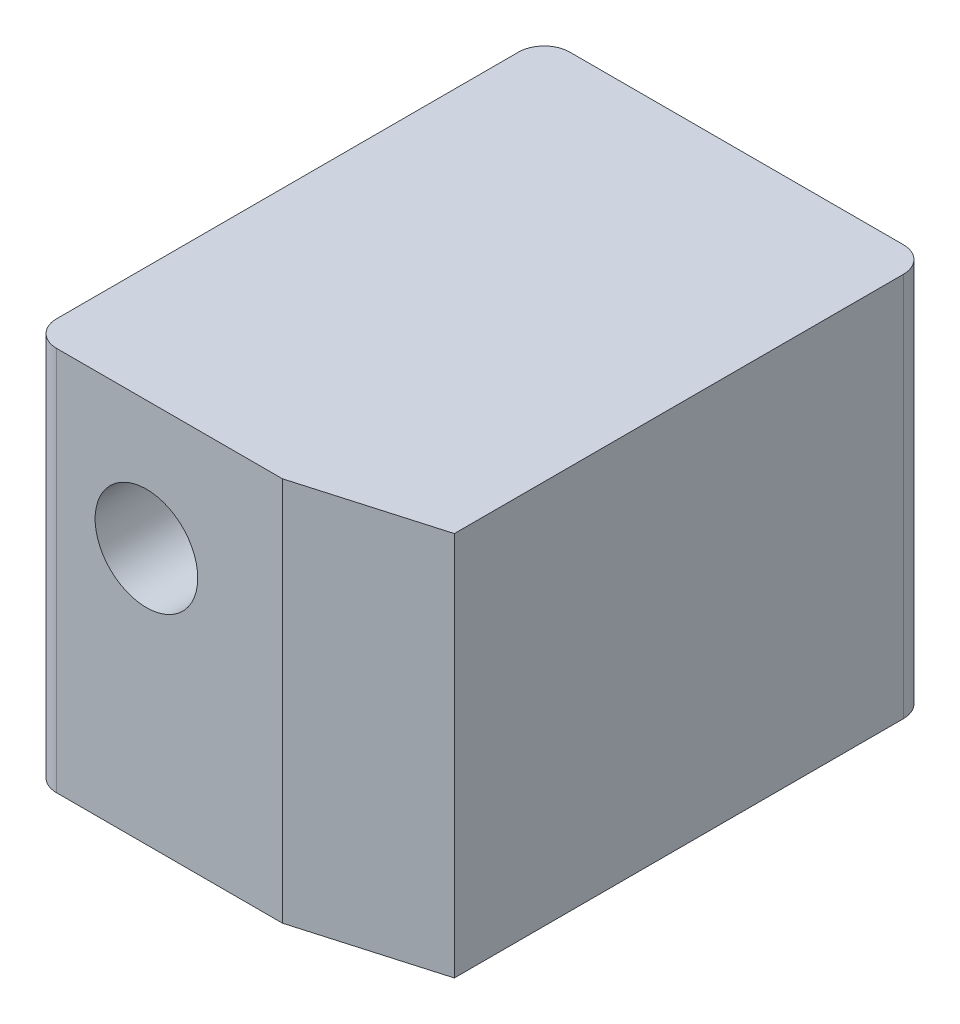
ISO-10303-21;
HEADER;
FILE_DESCRIPTION(('STEP AP214'),'2;1');
FILE_NAME('part.step','',(''),(''),'','','');
FILE_SCHEMA(('AUTOMOTIVE_DESIGN { 1 0 10303 214 1 1 1 1 }'));
ENDSEC;
DATA;
#1=APPLICATION_CONTEXT('core data for automotive mechanical design processes');
#2=APPLICATION_PROTOCOL_DEFINITION('international standard','automotive_design',2000,#1);
#3=PRODUCT_CONTEXT('',#1,'mechanical');
#4=PRODUCT('Part','Part','',(#3));
#5=PRODUCT_RELATED_PRODUCT_CATEGORY('part','',(#4));
#6=PRODUCT_DEFINITION_FORMATION('','',#4);
#7=PRODUCT_DEFINITION_CONTEXT('part definition',#1,'design');
#8=PRODUCT_DEFINITION('design','',#6,#7);
#9=PRODUCT_DEFINITION_SHAPE('','',#8);
#10=(LENGTH_UNIT() NAMED_UNIT(*) SI_UNIT(.MILLI.,.METRE.));
#11=(NAMED_UNIT(*) PLANE_ANGLE_UNIT() SI_UNIT($,.RADIAN.));
#12=(NAMED_UNIT(*) SI_UNIT($,.STERADIAN.) SOLID_ANGLE_UNIT());
#13=UNCERTAINTY_MEASURE_WITH_UNIT(LENGTH_MEASURE(1.E-05),#10,'distance_accuracy_value','');
#14=(GEOMETRIC_REPRESENTATION_CONTEXT(3) GLOBAL_UNCERTAINTY_ASSIGNED_CONTEXT((#13)) GLOBAL_UNIT_ASSIGNED_CONTEXT((#10,
#11,#12)) REPRESENTATION_CONTEXT('',''));
#15=CARTESIAN_POINT('',(0.,0.,0.));
#16=DIRECTION('',(0.,0.,1.));
#17=DIRECTION('',(1.,0.,0.));
#18=AXIS2_PLACEMENT_3D('',#15,#16,#17);
#19=CARTESIAN_POINT('',(0.,15.,0.));
#20=DIRECTION('',(0.,0.,-1.));
#21=DIRECTION('',(-1.,0.,0.));
#22=AXIS2_PLACEMENT_3D('',#19,#20,#21);
#23=PLANE('',#22);
#24=CARTESIAN_POINT('',(-3.,10.,0.));
#25=DIRECTION('',(0.,0.,1.));
#26=DIRECTION('',(1.,0.,0.));
#27=AXIS2_PLACEMENT_3D('',#24,#25,#26);
#28=CIRCLE('',#27,2.);
#29=CARTESIAN_POINT('',(-1.,10.,0.));
#30=VERTEX_POINT('',#29);
#31=EDGE_CURVE('E110',#30,#30,#28,.T.);
#32=ORIENTED_EDGE('',*,*,#31,.F.);
#33=EDGE_LOOP('',(#32));
#34=FACE_BOUND('',#33,.T.);
#35=DIRECTION('',(1.,0.,0.));
#36=VECTOR('',#35,1.);
#37=CARTESIAN_POINT('',(0.,0.,0.));
#38=LINE('',#37,#36);
#39=CARTESIAN_POINT('',(-6.5,0.,0.));
#40=VERTEX_POINT('',#39);
#41=CARTESIAN_POINT('',(2.30000000000001,0.,0.));
#42=VERTEX_POINT('',#41);
#43=EDGE_CURVE('E127',#40,#42,#38,.T.);
#44=ORIENTED_EDGE('',*,*,#43,.T.);
#45=DIRECTION('',(0.,1.,0.));
#46=VECTOR('',#45,1.);
#47=CARTESIAN_POINT('',(2.3,-0.000999999999999265,0.));
#48=LINE('',#47,#46);
#49=CARTESIAN_POINT('',(2.3,15.,0.));
#50=VERTEX_POINT('',#49);
#51=EDGE_CURVE('E52',#42,#50,#48,.T.);
#52=ORIENTED_EDGE('',*,*,#51,.T.);
#53=DIRECTION('',(1.,0.,0.));
#54=VECTOR('',#53,1.);
#55=CARTESIAN_POINT('',(0.,15.,0.));
#56=LINE('',#55,#54);
#57=CARTESIAN_POINT('',(-6.5,15.,0.));
#58=VERTEX_POINT('',#57);
#59=EDGE_CURVE('E137',#58,#50,#56,.T.);
#60=ORIENTED_EDGE('',*,*,#59,.F.);
#61=DIRECTION('',(0.,-1.,0.));
#62=VECTOR('',#61,1.);
#63=CARTESIAN_POINT('',(-6.5,15.,0.));
#64=LINE('',#63,#62);
#65=EDGE_CURVE('E11',#58,#40,#64,.T.);
#66=ORIENTED_EDGE('',*,*,#65,.T.);
#67=EDGE_LOOP('',(#44,#52,#60,#66));
#68=FACE_BOUND('',#67,.T.);
#69=ADVANCED_FACE('F37',(#34,#68),#23,.F.);
#70=CARTESIAN_POINT('',(7.5,15.,-20.));
#71=DIRECTION('',(-1.,0.,0.));
#72=DIRECTION('',(0.,0.,1.));
#73=AXIS2_PLACEMENT_3D('',#70,#71,#72);
#74=PLANE('',#73);
#75=DIRECTION('',(0.,0.,-1.));
#76=VECTOR('',#75,1.);
#77=CARTESIAN_POINT('',(7.5,15.,-20.));
#78=LINE('',#77,#76);
#79=CARTESIAN_POINT('',(7.5,15.,-1.5));
#80=VERTEX_POINT('',#79);
#81=CARTESIAN_POINT('',(7.5,15.,-19.));
#82=VERTEX_POINT('',#81);
#83=EDGE_CURVE('E118',#80,#82,#78,.T.);
#84=ORIENTED_EDGE('',*,*,#83,.F.);
#85=DIRECTION('',(0.,1.,0.));
#86=VECTOR('',#85,1.);
#87=CARTESIAN_POINT('',(7.5,-0.000999999999999265,-1.5));
#88=LINE('',#87,#86);
#89=CARTESIAN_POINT('',(7.5,0.,-1.5));
#90=VERTEX_POINT('',#89);
#91=EDGE_CURVE('E104',#90,#80,#88,.T.);
#92=ORIENTED_EDGE('',*,*,#91,.F.);
#93=DIRECTION('',(0.,0.,-1.));
#94=VECTOR('',#93,1.);
#95=CARTESIAN_POINT('',(7.5,0.,-20.));
#96=LINE('',#95,#94);
#97=CARTESIAN_POINT('',(7.5,0.,-19.));
#98=VERTEX_POINT('',#97);
#99=EDGE_CURVE('E116',#90,#98,#96,.T.);
#100=ORIENTED_EDGE('',*,*,#99,.T.);
#101=DIRECTION('',(0.,-1.,0.));
#102=VECTOR('',#101,1.);
#103=CARTESIAN_POINT('',(7.5,15.,-19.));
#104=LINE('',#103,#102);
#105=EDGE_CURVE('E149',#98,#82,#104,.F.);
#106=ORIENTED_EDGE('',*,*,#105,.T.);
#107=EDGE_LOOP('',(#84,#92,#100,#106));
#108=FACE_BOUND('',#107,.T.);
#109=ADVANCED_FACE('F114',(#108),#74,.F.);
#110=CARTESIAN_POINT('',(-7.5,15.,-20.));
#111=DIRECTION('',(0.,0.,1.));
#112=DIRECTION('',(1.,0.,0.));
#113=AXIS2_PLACEMENT_3D('',#110,#111,#112);
#114=PLANE('',#113);
#115=DIRECTION('',(-1.,0.,0.));
#116=VECTOR('',#115,1.);
#117=CARTESIAN_POINT('',(-7.5,15.,-20.));
#118=LINE('',#117,#116);
#119=CARTESIAN_POINT('',(6.5,15.,-20.));
#120=VERTEX_POINT('',#119);
#121=CARTESIAN_POINT('',(-6.5,15.,-20.));
#122=VERTEX_POINT('',#121);
#123=EDGE_CURVE('E171',#120,#122,#118,.T.);
#124=ORIENTED_EDGE('',*,*,#123,.F.);
#125=DIRECTION('',(0.,-1.,0.));
#126=VECTOR('',#125,1.);
#127=CARTESIAN_POINT('',(6.5,15.,-20.));
#128=LINE('',#127,#126);
#129=CARTESIAN_POINT('',(6.5,0.,-20.));
#130=VERTEX_POINT('',#129);
#131=EDGE_CURVE('E140',#120,#130,#128,.T.);
#132=ORIENTED_EDGE('',*,*,#131,.T.);
#133=DIRECTION('',(-1.,0.,0.));
#134=VECTOR('',#133,1.);
#135=CARTESIAN_POINT('',(-7.5,0.,-20.));
#136=LINE('',#135,#134);
#137=CARTESIAN_POINT('',(-6.5,0.,-20.));
#138=VERTEX_POINT('',#137);
#139=EDGE_CURVE('E126',#130,#138,#136,.T.);
#140=ORIENTED_EDGE('',*,*,#139,.T.);
#141=DIRECTION('',(0.,-1.,0.));
#142=VECTOR('',#141,1.);
#143=CARTESIAN_POINT('',(-6.5,15.,-20.));
#144=LINE('',#143,#142);
#145=EDGE_CURVE('E138',#138,#122,#144,.F.);
#146=ORIENTED_EDGE('',*,*,#145,.T.);
#147=EDGE_LOOP('',(#124,#132,#140,#146));
#148=FACE_BOUND('',#147,.T.);
#149=ADVANCED_FACE('F183',(#148),#114,.F.);
#150=CARTESIAN_POINT('',(-7.5,15.,0.));
#151=DIRECTION('',(1.,0.,0.));
#152=DIRECTION('',(0.,0.,-1.));
#153=AXIS2_PLACEMENT_3D('',#150,#151,#152);
#154=PLANE('',#153);
#155=DIRECTION('',(0.,0.,1.));
#156=VECTOR('',#155,1.);
#157=CARTESIAN_POINT('',(-7.5,15.,0.));
#158=LINE('',#157,#156);
#159=CARTESIAN_POINT('',(-7.5,15.,-19.));
#160=VERTEX_POINT('',#159);
#161=CARTESIAN_POINT('',(-7.5,15.,-1.));
#162=VERTEX_POINT('',#161);
#163=EDGE_CURVE('E141',#160,#162,#158,.T.);
#164=ORIENTED_EDGE('',*,*,#163,.F.);
#165=DIRECTION('',(0.,-1.,0.));
#166=VECTOR('',#165,1.);
#167=CARTESIAN_POINT('',(-7.5,15.,-19.));
#168=LINE('',#167,#166);
#169=CARTESIAN_POINT('',(-7.5,0.,-19.));
#170=VERTEX_POINT('',#169);
#171=EDGE_CURVE('E45',#160,#170,#168,.T.);
#172=ORIENTED_EDGE('',*,*,#171,.T.);
#173=DIRECTION('',(0.,0.,1.));
#174=VECTOR('',#173,1.);
#175=CARTESIAN_POINT('',(-7.5,0.,0.));
#176=LINE('',#175,#174);
#177=CARTESIAN_POINT('',(-7.5,0.,-1.));
#178=VERTEX_POINT('',#177);
#179=EDGE_CURVE('E130',#170,#178,#176,.T.);
#180=ORIENTED_EDGE('',*,*,#179,.T.);
#181=DIRECTION('',(0.,-1.,0.));
#182=VECTOR('',#181,1.);
#183=CARTESIAN_POINT('',(-7.5,15.,-1.));
#184=LINE('',#183,#182);
#185=EDGE_CURVE('E60',#178,#162,#184,.F.);
#186=ORIENTED_EDGE('',*,*,#185,.T.);
#187=EDGE_LOOP('',(#164,#172,#180,#186));
#188=FACE_BOUND('',#187,.T.);
#189=ADVANCED_FACE('F160',(#188),#154,.F.);
#190=CARTESIAN_POINT('',(0.,15.,0.));
#191=DIRECTION('',(0.,-1.,0.));
#192=DIRECTION('',(0.,0.,-1.));
#193=AXIS2_PLACEMENT_3D('',#190,#191,#192);
#194=PLANE('',#193);
#195=ORIENTED_EDGE('',*,*,#59,.T.);
#196=DIRECTION('',(-0.960823591180894,0.,0.277160651302181));
#197=VECTOR('',#196,1.);
#198=CARTESIAN_POINT('',(2.3,15.,0.));
#199=LINE('',#198,#197);
#200=EDGE_CURVE('E119',#80,#50,#199,.T.);
#201=ORIENTED_EDGE('',*,*,#200,.F.);
#202=ORIENTED_EDGE('',*,*,#83,.T.);
#203=CARTESIAN_POINT('',(6.5,15.,-19.));
#204=DIRECTION('',(0.,-1.,0.));
#205=DIRECTION('',(0.,0.,-1.));
#206=AXIS2_PLACEMENT_3D('',#203,#204,#205);
#207=CIRCLE('',#206,1.);
#208=EDGE_CURVE('E155',#82,#120,#207,.F.);
#209=ORIENTED_EDGE('',*,*,#208,.T.);
#210=ORIENTED_EDGE('',*,*,#123,.T.);
#211=CARTESIAN_POINT('',(-6.5,15.,-19.));
#212=DIRECTION('',(0.,-1.,0.));
#213=DIRECTION('',(0.,0.,-1.));
#214=AXIS2_PLACEMENT_3D('',#211,#212,#213);
#215=CIRCLE('',#214,1.);
#216=EDGE_CURVE('E153',#122,#160,#215,.F.);
#217=ORIENTED_EDGE('',*,*,#216,.T.);
#218=ORIENTED_EDGE('',*,*,#163,.T.);
#219=CARTESIAN_POINT('',(-6.5,15.,-1.));
#220=DIRECTION('',(0.,-1.,0.));
#221=DIRECTION('',(0.,0.,-1.));
#222=AXIS2_PLACEMENT_3D('',#219,#220,#221);
#223=CIRCLE('',#222,1.);
#224=EDGE_CURVE('E151',#162,#58,#223,.F.);
#225=ORIENTED_EDGE('',*,*,#224,.T.);
#226=EDGE_LOOP('',(#195,#201,#202,#209,#210,#217,#218,#225));
#227=FACE_BOUND('',#226,.T.);
#228=ADVANCED_FACE('F178',(#227),#194,.F.);
#229=CARTESIAN_POINT('',(0.,0.,0.));
#230=DIRECTION('',(0.,-1.,0.));
#231=DIRECTION('',(0.,0.,-1.));
#232=AXIS2_PLACEMENT_3D('',#229,#230,#231);
#233=PLANE('',#232);
#234=DIRECTION('',(-0.960823591180895,0.,0.277160651302181));
#235=VECTOR('',#234,1.);
#236=CARTESIAN_POINT('',(2.3,0.,0.));
#237=LINE('',#236,#235);
#238=EDGE_CURVE('E101',#90,#42,#237,.T.);
#239=ORIENTED_EDGE('',*,*,#238,.T.);
#240=ORIENTED_EDGE('',*,*,#43,.F.);
#241=CARTESIAN_POINT('',(-6.5,0.,-1.));
#242=DIRECTION('',(0.,-1.,0.));
#243=DIRECTION('',(0.,0.,-1.));
#244=AXIS2_PLACEMENT_3D('',#241,#242,#243);
#245=CIRCLE('',#244,1.);
#246=EDGE_CURVE('E144',#40,#178,#245,.T.);
#247=ORIENTED_EDGE('',*,*,#246,.T.);
#248=ORIENTED_EDGE('',*,*,#179,.F.);
#249=CARTESIAN_POINT('',(-6.5,0.,-19.));
#250=DIRECTION('',(0.,-1.,0.));
#251=DIRECTION('',(0.,0.,-1.));
#252=AXIS2_PLACEMENT_3D('',#249,#250,#251);
#253=CIRCLE('',#252,1.);
#254=EDGE_CURVE('E146',#170,#138,#253,.T.);
#255=ORIENTED_EDGE('',*,*,#254,.T.);
#256=ORIENTED_EDGE('',*,*,#139,.F.);
#257=CARTESIAN_POINT('',(6.5,0.,-19.));
#258=DIRECTION('',(0.,-1.,0.));
#259=DIRECTION('',(0.,0.,-1.));
#260=AXIS2_PLACEMENT_3D('',#257,#258,#259);
#261=CIRCLE('',#260,1.);
#262=EDGE_CURVE('E124',#130,#98,#261,.T.);
#263=ORIENTED_EDGE('',*,*,#262,.T.);
#264=ORIENTED_EDGE('',*,*,#99,.F.);
#265=EDGE_LOOP('',(#239,#240,#247,#248,#255,#256,#263,#264));
#266=FACE_BOUND('',#265,.T.);
#267=CARTESIAN_POINT('',(-3.,0.,-16.));
#268=DIRECTION('',(0.,-1.,0.));
#269=DIRECTION('',(0.,0.,-1.));
#270=AXIS2_PLACEMENT_3D('',#267,#268,#269);
#271=CIRCLE('',#270,2.);
#272=CARTESIAN_POINT('',(-3.,0.,-18.));
#273=VERTEX_POINT('',#272);
#274=EDGE_CURVE('E198',#273,#273,#271,.T.);
#275=ORIENTED_EDGE('',*,*,#274,.F.);
#276=EDGE_LOOP('',(#275));
#277=FACE_BOUND('',#276,.T.);
#278=CARTESIAN_POINT('',(3.,0.,-4.));
#279=DIRECTION('',(0.,-1.,0.));
#280=DIRECTION('',(0.,0.,-1.));
#281=AXIS2_PLACEMENT_3D('',#278,#279,#280);
#282=CIRCLE('',#281,2.);
#283=CARTESIAN_POINT('',(3.,0.,-6.));
#284=VERTEX_POINT('',#283);
#285=EDGE_CURVE('E174',#284,#284,#282,.T.);
#286=ORIENTED_EDGE('',*,*,#285,.F.);
#287=EDGE_LOOP('',(#286));
#288=FACE_BOUND('',#287,.T.);
#289=ADVANCED_FACE('F121',(#266,#277,#288),#233,.T.);
#290=CARTESIAN_POINT('',(3.,12.,-4.));
#291=DIRECTION('',(0.,-1.,0.));
#292=DIRECTION('',(0.,0.,-1.));
#293=AXIS2_PLACEMENT_3D('',#290,#291,#292);
#294=CYLINDRICAL_SURFACE('',#293,2.);
#295=CARTESIAN_POINT('',(3.,12.,-4.));
#296=DIRECTION('',(0.,-1.,0.));
#297=DIRECTION('',(0.,0.,-1.));
#298=AXIS2_PLACEMENT_3D('',#295,#296,#297);
#299=CIRCLE('',#298,2.);
#300=CARTESIAN_POINT('',(3.,12.,-6.));
#301=VERTEX_POINT('',#300);
#302=EDGE_CURVE('E200',#301,#301,#299,.T.);
#303=ORIENTED_EDGE('',*,*,#302,.F.);
#304=EDGE_LOOP('',(#303));
#305=FACE_BOUND('',#304,.T.);
#306=ORIENTED_EDGE('',*,*,#285,.T.);
#307=EDGE_LOOP('',(#306));
#308=FACE_BOUND('',#307,.T.);
#309=ADVANCED_FACE('F207',(#305,#308),#294,.F.);
#310=CARTESIAN_POINT('',(3.,12.,-4.));
#311=DIRECTION('',(0.,-1.,0.));
#312=DIRECTION('',(0.,0.,-1.));
#313=AXIS2_PLACEMENT_3D('',#310,#311,#312);
#314=PLANE('',#313);
#315=ORIENTED_EDGE('',*,*,#302,.T.);
#316=EDGE_LOOP('',(#315));
#317=FACE_BOUND('',#316,.T.);
#318=ADVANCED_FACE('F215',(#317),#314,.T.);
#319=CARTESIAN_POINT('',(-3.,12.,-16.));
#320=DIRECTION('',(0.,-1.,0.));
#321=DIRECTION('',(0.,0.,-1.));
#322=AXIS2_PLACEMENT_3D('',#319,#320,#321);
#323=CYLINDRICAL_SURFACE('',#322,2.);
#324=CARTESIAN_POINT('',(-3.,12.,-16.));
#325=DIRECTION('',(0.,-1.,0.));
#326=DIRECTION('',(0.,0.,-1.));
#327=AXIS2_PLACEMENT_3D('',#324,#325,#326);
#328=CIRCLE('',#327,2.);
#329=CARTESIAN_POINT('',(-3.,12.,-18.));
#330=VERTEX_POINT('',#329);
#331=EDGE_CURVE('E132',#330,#330,#328,.T.);
#332=ORIENTED_EDGE('',*,*,#331,.F.);
#333=EDGE_LOOP('',(#332));
#334=FACE_BOUND('',#333,.T.);
#335=ORIENTED_EDGE('',*,*,#274,.T.);
#336=EDGE_LOOP('',(#335));
#337=FACE_BOUND('',#336,.T.);
#338=ADVANCED_FACE('F253',(#334,#337),#323,.F.);
#339=CARTESIAN_POINT('',(-3.,12.,-16.));
#340=DIRECTION('',(0.,-1.,0.));
#341=DIRECTION('',(0.,0.,-1.));
#342=AXIS2_PLACEMENT_3D('',#339,#340,#341);
#343=PLANE('',#342);
#344=ORIENTED_EDGE('',*,*,#331,.T.);
#345=EDGE_LOOP('',(#344));
#346=FACE_BOUND('',#345,.T.);
#347=ADVANCED_FACE('F249',(#346),#343,.T.);
#348=CARTESIAN_POINT('',(-3.,10.,-12.));
#349=DIRECTION('',(0.,0.,1.));
#350=DIRECTION('',(1.,0.,0.));
#351=AXIS2_PLACEMENT_3D('',#348,#349,#350);
#352=CYLINDRICAL_SURFACE('',#351,2.);
#353=CARTESIAN_POINT('',(-3.,10.,-12.));
#354=DIRECTION('',(0.,0.,1.));
#355=DIRECTION('',(1.,0.,0.));
#356=AXIS2_PLACEMENT_3D('',#353,#354,#355);
#357=CIRCLE('',#356,2.);
#358=CARTESIAN_POINT('',(-1.,10.,-12.));
#359=VERTEX_POINT('',#358);
#360=EDGE_CURVE('E191',#359,#359,#357,.T.);
#361=ORIENTED_EDGE('',*,*,#360,.F.);
#362=EDGE_LOOP('',(#361));
#363=FACE_BOUND('',#362,.T.);
#364=ORIENTED_EDGE('',*,*,#31,.T.);
#365=EDGE_LOOP('',(#364));
#366=FACE_BOUND('',#365,.T.);
#367=ADVANCED_FACE('F245',(#363,#366),#352,.F.);
#368=CARTESIAN_POINT('',(-3.,10.,-12.));
#369=DIRECTION('',(0.,0.,1.));
#370=DIRECTION('',(1.,0.,0.));
#371=AXIS2_PLACEMENT_3D('',#368,#369,#370);
#372=PLANE('',#371);
#373=ORIENTED_EDGE('',*,*,#360,.T.);
#374=EDGE_LOOP('',(#373));
#375=FACE_BOUND('',#374,.T.);
#376=ADVANCED_FACE('F231',(#375),#372,.T.);
#377=CARTESIAN_POINT('',(6.5,15.,-19.));
#378=DIRECTION('',(0.,-1.,0.));
#379=DIRECTION('',(0.,0.,-1.));
#380=AXIS2_PLACEMENT_3D('',#377,#378,#379);
#381=CYLINDRICAL_SURFACE('',#380,1.);
#382=ORIENTED_EDGE('',*,*,#208,.F.);
#383=ORIENTED_EDGE('',*,*,#105,.F.);
#384=ORIENTED_EDGE('',*,*,#262,.F.);
#385=ORIENTED_EDGE('',*,*,#131,.F.);
#386=EDGE_LOOP('',(#382,#383,#384,#385));
#387=FACE_BOUND('',#386,.T.);
#388=ADVANCED_FACE('F187',(#387),#381,.T.);
#389=CARTESIAN_POINT('',(-6.5,15.,-19.));
#390=DIRECTION('',(0.,-1.,0.));
#391=DIRECTION('',(0.,0.,-1.));
#392=AXIS2_PLACEMENT_3D('',#389,#390,#391);
#393=CYLINDRICAL_SURFACE('',#392,1.);
#394=ORIENTED_EDGE('',*,*,#216,.F.);
#395=ORIENTED_EDGE('',*,*,#145,.F.);
#396=ORIENTED_EDGE('',*,*,#254,.F.);
#397=ORIENTED_EDGE('',*,*,#171,.F.);
#398=EDGE_LOOP('',(#394,#395,#396,#397));
#399=FACE_BOUND('',#398,.T.);
#400=ADVANCED_FACE('F181',(#399),#393,.T.);
#401=CARTESIAN_POINT('',(-6.5,15.,-1.));
#402=DIRECTION('',(0.,-1.,0.));
#403=DIRECTION('',(0.,0.,-1.));
#404=AXIS2_PLACEMENT_3D('',#401,#402,#403);
#405=CYLINDRICAL_SURFACE('',#404,1.);
#406=ORIENTED_EDGE('',*,*,#224,.F.);
#407=ORIENTED_EDGE('',*,*,#185,.F.);
#408=ORIENTED_EDGE('',*,*,#246,.F.);
#409=ORIENTED_EDGE('',*,*,#65,.F.);
#410=EDGE_LOOP('',(#406,#407,#408,#409));
#411=FACE_BOUND('',#410,.T.);
#412=ADVANCED_FACE('F39',(#411),#405,.T.);
#413=CARTESIAN_POINT('',(2.3,-0.000999999999999265,0.));
#414=DIRECTION('',(-0.277160651302181,0.,-0.960823591180894));
#415=DIRECTION('',(-0.960823591180895,0.,0.277160651302181));
#416=AXIS2_PLACEMENT_3D('',#413,#414,#415);
#417=PLANE('',#416);
#418=ORIENTED_EDGE('',*,*,#91,.T.);
#419=ORIENTED_EDGE('',*,*,#200,.T.);
#420=ORIENTED_EDGE('',*,*,#51,.F.);
#421=ORIENTED_EDGE('',*,*,#238,.F.);
#422=EDGE_LOOP('',(#418,#419,#420,#421));
#423=FACE_BOUND('',#422,.T.);
#424=ADVANCED_FACE('F103',(#423),#417,.F.);
#425=CLOSED_SHELL('',(#69,#109,#149,#189,#228,#289,#309,#318,#338,#347,#367,#376,#388,#400,#412,#424));
#426=MANIFOLD_SOLID_BREP('B2',#425);
#427=ADVANCED_BREP_SHAPE_REPRESENTATION('',(#18,#426),#14);
#428=SHAPE_DEFINITION_REPRESENTATION(#9,#427);
ENDSEC;
END-ISO-10303-21;
